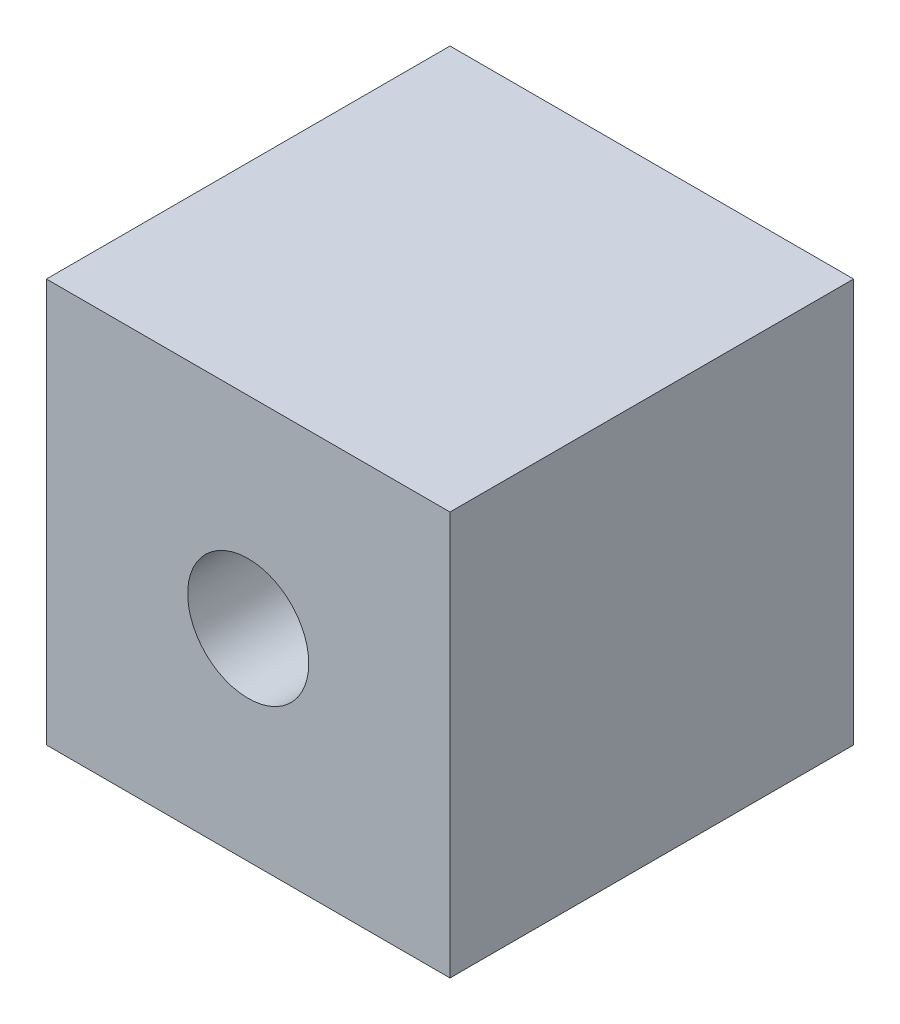
ISO-10303-21;
HEADER;
FILE_DESCRIPTION(('STEP AP214'),'2;1');
FILE_NAME('part.step','',(''),(''),'','','');
FILE_SCHEMA(('AUTOMOTIVE_DESIGN { 1 0 10303 214 1 1 1 1 }'));
ENDSEC;
DATA;
#1=APPLICATION_CONTEXT('core data for automotive mechanical design processes');
#2=APPLICATION_PROTOCOL_DEFINITION('international standard','automotive_design',2000,#1);
#3=PRODUCT_CONTEXT('',#1,'mechanical');
#4=PRODUCT('Part','Part','',(#3));
#5=PRODUCT_RELATED_PRODUCT_CATEGORY('part','',(#4));
#6=PRODUCT_DEFINITION_FORMATION('','',#4);
#7=PRODUCT_DEFINITION_CONTEXT('part definition',#1,'design');
#8=PRODUCT_DEFINITION('design','',#6,#7);
#9=PRODUCT_DEFINITION_SHAPE('','',#8);
#10=(LENGTH_UNIT() NAMED_UNIT(*) SI_UNIT(.MILLI.,.METRE.));
#11=(NAMED_UNIT(*) PLANE_ANGLE_UNIT() SI_UNIT($,.RADIAN.));
#12=(NAMED_UNIT(*) SI_UNIT($,.STERADIAN.) SOLID_ANGLE_UNIT());
#13=UNCERTAINTY_MEASURE_WITH_UNIT(LENGTH_MEASURE(1.E-05),#10,'distance_accuracy_value','');
#14=(GEOMETRIC_REPRESENTATION_CONTEXT(3) GLOBAL_UNCERTAINTY_ASSIGNED_CONTEXT((#13)) GLOBAL_UNIT_ASSIGNED_CONTEXT((#10,
#11,#12)) REPRESENTATION_CONTEXT('',''));
#15=CARTESIAN_POINT('',(0.,0.,0.));
#16=DIRECTION('',(0.,0.,1.));
#17=DIRECTION('',(1.,0.,0.));
#18=AXIS2_PLACEMENT_3D('',#15,#16,#17);
#19=CARTESIAN_POINT('',(0.,0.,10.));
#20=DIRECTION('',(1.,0.,0.));
#21=DIRECTION('',(0.,0.,-1.));
#22=AXIS2_PLACEMENT_3D('',#19,#20,#21);
#23=PLANE('',#22);
#24=DIRECTION('',(0.,-1.,0.));
#25=VECTOR('',#24,1.);
#26=CARTESIAN_POINT('',(0.,0.,0.));
#27=LINE('',#26,#25);
#28=CARTESIAN_POINT('',(0.,10.,0.));
#29=VERTEX_POINT('',#28);
#30=CARTESIAN_POINT('',(0.,0.,0.));
#31=VERTEX_POINT('',#30);
#32=EDGE_CURVE('E98',#29,#31,#27,.T.);
#33=ORIENTED_EDGE('',*,*,#32,.T.);
#34=DIRECTION('',(0.,0.,-1.));
#35=VECTOR('',#34,1.);
#36=CARTESIAN_POINT('',(0.,0.,10.));
#37=LINE('',#36,#35);
#38=CARTESIAN_POINT('',(0.,0.,10.));
#39=VERTEX_POINT('',#38);
#40=EDGE_CURVE('E11',#39,#31,#37,.T.);
#41=ORIENTED_EDGE('',*,*,#40,.F.);
#42=DIRECTION('',(0.,-1.,0.));
#43=VECTOR('',#42,1.);
#44=CARTESIAN_POINT('',(0.,0.,10.));
#45=LINE('',#44,#43);
#46=CARTESIAN_POINT('',(0.,10.,10.));
#47=VERTEX_POINT('',#46);
#48=EDGE_CURVE('E86',#47,#39,#45,.T.);
#49=ORIENTED_EDGE('',*,*,#48,.F.);
#50=DIRECTION('',(0.,0.,-1.));
#51=VECTOR('',#50,1.);
#52=CARTESIAN_POINT('',(0.,10.,10.));
#53=LINE('',#52,#51);
#54=EDGE_CURVE('E94',#47,#29,#53,.T.);
#55=ORIENTED_EDGE('',*,*,#54,.T.);
#56=EDGE_LOOP('',(#33,#41,#49,#55));
#57=FACE_BOUND('',#56,.T.);
#58=ADVANCED_FACE('F35',(#57),#23,.F.);
#59=CARTESIAN_POINT('',(0.,0.,10.));
#60=DIRECTION('',(0.,1.,0.));
#61=DIRECTION('',(0.,0.,1.));
#62=AXIS2_PLACEMENT_3D('',#59,#60,#61);
#63=PLANE('',#62);
#64=DIRECTION('',(1.,0.,0.));
#65=VECTOR('',#64,1.);
#66=CARTESIAN_POINT('',(0.,0.,0.));
#67=LINE('',#66,#65);
#68=CARTESIAN_POINT('',(10.,0.,0.));
#69=VERTEX_POINT('',#68);
#70=EDGE_CURVE('E90',#31,#69,#67,.T.);
#71=ORIENTED_EDGE('',*,*,#70,.T.);
#72=DIRECTION('',(0.,0.,-1.));
#73=VECTOR('',#72,1.);
#74=CARTESIAN_POINT('',(10.,0.,10.));
#75=LINE('',#74,#73);
#76=CARTESIAN_POINT('',(10.,0.,10.));
#77=VERTEX_POINT('',#76);
#78=EDGE_CURVE('E43',#77,#69,#75,.T.);
#79=ORIENTED_EDGE('',*,*,#78,.F.);
#80=DIRECTION('',(1.,0.,0.));
#81=VECTOR('',#80,1.);
#82=CARTESIAN_POINT('',(0.,0.,10.));
#83=LINE('',#82,#81);
#84=EDGE_CURVE('E81',#39,#77,#83,.T.);
#85=ORIENTED_EDGE('',*,*,#84,.F.);
#86=ORIENTED_EDGE('',*,*,#40,.T.);
#87=EDGE_LOOP('',(#71,#79,#85,#86));
#88=FACE_BOUND('',#87,.T.);
#89=ADVANCED_FACE('F89',(#88),#63,.F.);
#90=CARTESIAN_POINT('',(10.,0.,10.));
#91=DIRECTION('',(-1.,0.,0.));
#92=DIRECTION('',(0.,0.,1.));
#93=AXIS2_PLACEMENT_3D('',#90,#91,#92);
#94=PLANE('',#93);
#95=DIRECTION('',(0.,1.,0.));
#96=VECTOR('',#95,1.);
#97=CARTESIAN_POINT('',(10.,0.,0.));
#98=LINE('',#97,#96);
#99=CARTESIAN_POINT('',(10.,10.,0.));
#100=VERTEX_POINT('',#99);
#101=EDGE_CURVE('E68',#69,#100,#98,.T.);
#102=ORIENTED_EDGE('',*,*,#101,.T.);
#103=DIRECTION('',(0.,0.,-1.));
#104=VECTOR('',#103,1.);
#105=CARTESIAN_POINT('',(10.,10.,10.));
#106=LINE('',#105,#104);
#107=CARTESIAN_POINT('',(10.,10.,10.));
#108=VERTEX_POINT('',#107);
#109=EDGE_CURVE('E91',#108,#100,#106,.T.);
#110=ORIENTED_EDGE('',*,*,#109,.F.);
#111=DIRECTION('',(0.,1.,0.));
#112=VECTOR('',#111,1.);
#113=CARTESIAN_POINT('',(10.,0.,10.));
#114=LINE('',#113,#112);
#115=EDGE_CURVE('E84',#77,#108,#114,.T.);
#116=ORIENTED_EDGE('',*,*,#115,.F.);
#117=ORIENTED_EDGE('',*,*,#78,.T.);
#118=EDGE_LOOP('',(#102,#110,#116,#117));
#119=FACE_BOUND('',#118,.T.);
#120=ADVANCED_FACE('F92',(#119),#94,.F.);
#121=CARTESIAN_POINT('',(0.,10.,10.));
#122=DIRECTION('',(0.,-1.,0.));
#123=DIRECTION('',(0.,0.,-1.));
#124=AXIS2_PLACEMENT_3D('',#121,#122,#123);
#125=PLANE('',#124);
#126=DIRECTION('',(-1.,0.,0.));
#127=VECTOR('',#126,1.);
#128=CARTESIAN_POINT('',(0.,10.,0.));
#129=LINE('',#128,#127);
#130=EDGE_CURVE('E74',#100,#29,#129,.T.);
#131=ORIENTED_EDGE('',*,*,#130,.T.);
#132=ORIENTED_EDGE('',*,*,#54,.F.);
#133=DIRECTION('',(-1.,0.,0.));
#134=VECTOR('',#133,1.);
#135=CARTESIAN_POINT('',(0.,10.,10.));
#136=LINE('',#135,#134);
#137=EDGE_CURVE('E51',#108,#47,#136,.T.);
#138=ORIENTED_EDGE('',*,*,#137,.F.);
#139=ORIENTED_EDGE('',*,*,#109,.T.);
#140=EDGE_LOOP('',(#131,#132,#138,#139));
#141=FACE_BOUND('',#140,.T.);
#142=ADVANCED_FACE('F106',(#141),#125,.F.);
#143=CARTESIAN_POINT('',(0.,0.,10.));
#144=DIRECTION('',(0.,0.,-1.));
#145=DIRECTION('',(-1.,0.,0.));
#146=AXIS2_PLACEMENT_3D('',#143,#144,#145);
#147=PLANE('',#146);
#148=CARTESIAN_POINT('',(5.,5.,10.));
#149=DIRECTION('',(0.,0.,1.));
#150=DIRECTION('',(1.,0.,0.));
#151=AXIS2_PLACEMENT_3D('',#148,#149,#150);
#152=CIRCLE('',#151,1.5);
#153=CARTESIAN_POINT('',(6.5,5.,10.));
#154=VERTEX_POINT('',#153);
#155=EDGE_CURVE('E112',#154,#154,#152,.T.);
#156=ORIENTED_EDGE('',*,*,#155,.F.);
#157=EDGE_LOOP('',(#156));
#158=FACE_BOUND('',#157,.T.);
#159=ORIENTED_EDGE('',*,*,#48,.T.);
#160=ORIENTED_EDGE('',*,*,#84,.T.);
#161=ORIENTED_EDGE('',*,*,#115,.T.);
#162=ORIENTED_EDGE('',*,*,#137,.T.);
#163=EDGE_LOOP('',(#159,#160,#161,#162));
#164=FACE_BOUND('',#163,.T.);
#165=ADVANCED_FACE('F82',(#158,#164),#147,.F.);
#166=CARTESIAN_POINT('',(0.,0.,0.));
#167=DIRECTION('',(0.,0.,-1.));
#168=DIRECTION('',(-1.,0.,0.));
#169=AXIS2_PLACEMENT_3D('',#166,#167,#168);
#170=PLANE('',#169);
#171=CARTESIAN_POINT('',(5.,5.,0.));
#172=DIRECTION('',(0.,0.,1.));
#173=DIRECTION('',(1.,0.,0.));
#174=AXIS2_PLACEMENT_3D('',#171,#172,#173);
#175=CIRCLE('',#174,1.5);
#176=CARTESIAN_POINT('',(6.5,5.,0.));
#177=VERTEX_POINT('',#176);
#178=EDGE_CURVE('E101',#177,#177,#175,.T.);
#179=ORIENTED_EDGE('',*,*,#178,.T.);
#180=EDGE_LOOP('',(#179));
#181=FACE_BOUND('',#180,.T.);
#182=ORIENTED_EDGE('',*,*,#32,.F.);
#183=ORIENTED_EDGE('',*,*,#130,.F.);
#184=ORIENTED_EDGE('',*,*,#101,.F.);
#185=ORIENTED_EDGE('',*,*,#70,.F.);
#186=EDGE_LOOP('',(#182,#183,#184,#185));
#187=FACE_BOUND('',#186,.T.);
#188=ADVANCED_FACE('F109',(#181,#187),#170,.T.);
#189=CARTESIAN_POINT('',(5.,5.,0.));
#190=DIRECTION('',(0.,0.,1.));
#191=DIRECTION('',(1.,0.,0.));
#192=AXIS2_PLACEMENT_3D('',#189,#190,#191);
#193=CYLINDRICAL_SURFACE('',#192,1.5);
#194=ORIENTED_EDGE('',*,*,#178,.F.);
#195=EDGE_LOOP('',(#194));
#196=FACE_BOUND('',#195,.T.);
#197=ORIENTED_EDGE('',*,*,#155,.T.);
#198=EDGE_LOOP('',(#197));
#199=FACE_BOUND('',#198,.T.);
#200=ADVANCED_FACE('F119',(#196,#199),#193,.F.);
#201=CLOSED_SHELL('',(#58,#89,#120,#142,#165,#188,#200));
#202=MANIFOLD_SOLID_BREP('B2',#201);
#203=ADVANCED_BREP_SHAPE_REPRESENTATION('',(#18,#202),#14);
#204=SHAPE_DEFINITION_REPRESENTATION(#9,#203);
ENDSEC;
END-ISO-10303-21;
